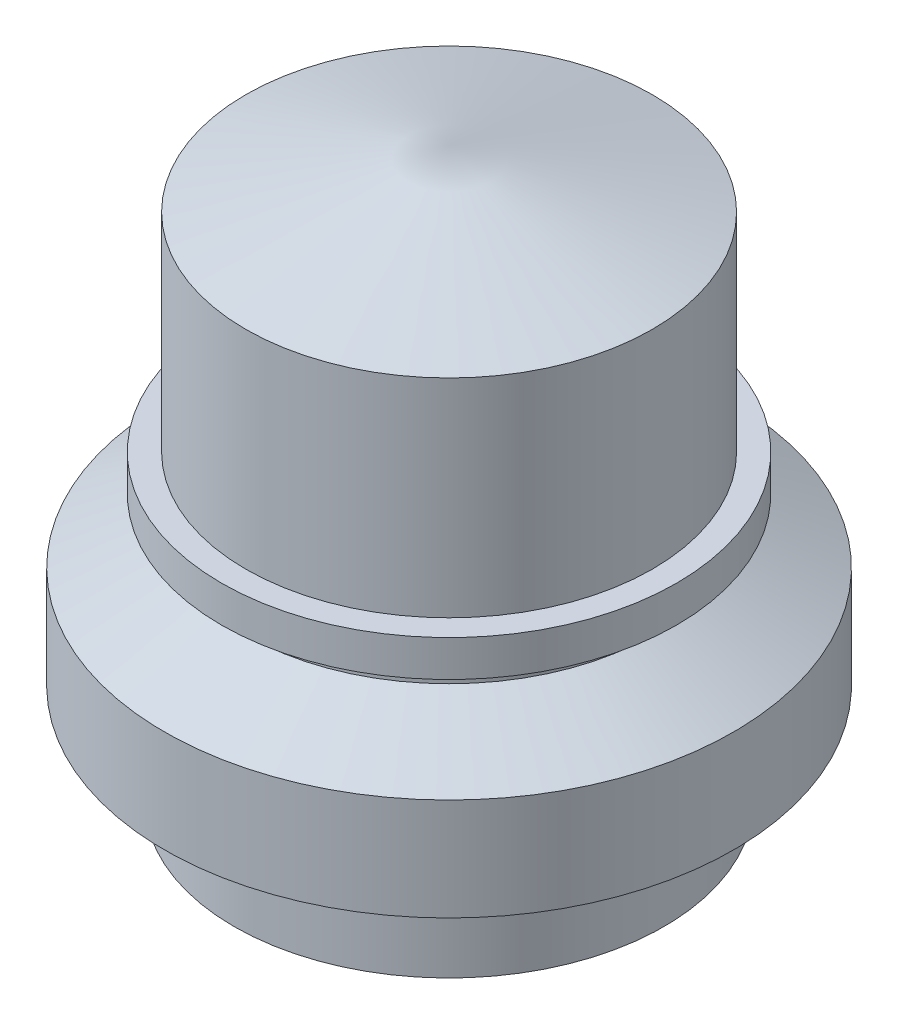
ISO-10303-21;
HEADER;
FILE_DESCRIPTION(('STEP AP214'),'2;1');
FILE_NAME('part.step','',(''),(''),'','','');
FILE_SCHEMA(('AUTOMOTIVE_DESIGN { 1 0 10303 214 1 1 1 1 }'));
ENDSEC;
DATA;
#1=APPLICATION_CONTEXT('core data for automotive mechanical design processes');
#2=APPLICATION_PROTOCOL_DEFINITION('international standard','automotive_design',2000,#1);
#3=PRODUCT_CONTEXT('',#1,'mechanical');
#4=PRODUCT('Part','Part','',(#3));
#5=PRODUCT_RELATED_PRODUCT_CATEGORY('part','',(#4));
#6=PRODUCT_DEFINITION_FORMATION('','',#4);
#7=PRODUCT_DEFINITION_CONTEXT('part definition',#1,'design');
#8=PRODUCT_DEFINITION('design','',#6,#7);
#9=PRODUCT_DEFINITION_SHAPE('','',#8);
#10=(LENGTH_UNIT() NAMED_UNIT(*) SI_UNIT(.MILLI.,.METRE.));
#11=(NAMED_UNIT(*) PLANE_ANGLE_UNIT() SI_UNIT($,.RADIAN.));
#12=(NAMED_UNIT(*) SI_UNIT($,.STERADIAN.) SOLID_ANGLE_UNIT());
#13=UNCERTAINTY_MEASURE_WITH_UNIT(LENGTH_MEASURE(1.E-05),#10,'distance_accuracy_value','');
#14=(GEOMETRIC_REPRESENTATION_CONTEXT(3) GLOBAL_UNCERTAINTY_ASSIGNED_CONTEXT((#13)) GLOBAL_UNIT_ASSIGNED_CONTEXT((#10,
#11,#12)) REPRESENTATION_CONTEXT('',''));
#15=CARTESIAN_POINT('',(0.,0.,0.));
#16=DIRECTION('',(0.,0.,1.));
#17=DIRECTION('',(1.,0.,0.));
#18=AXIS2_PLACEMENT_3D('',#15,#16,#17);
#19=CARTESIAN_POINT('',(0.,0.,0.));
#20=DIRECTION('',(0.,1.,0.));
#21=DIRECTION('',(0.,0.,1.));
#22=AXIS2_PLACEMENT_3D('',#19,#20,#21);
#23=PLANE('',#22);
#24=CARTESIAN_POINT('',(0.,0.,0.));
#25=DIRECTION('',(0.,-1.,0.));
#26=DIRECTION('',(0.,0.,-1.));
#27=AXIS2_PLACEMENT_3D('',#24,#25,#26);
#28=CIRCLE('',#27,17.);
#29=CARTESIAN_POINT('',(0.,0.,-17.));
#30=VERTEX_POINT('',#29);
#31=EDGE_CURVE('E13',#30,#30,#28,.T.);
#32=ORIENTED_EDGE('',*,*,#31,.T.);
#33=EDGE_LOOP('',(#32));
#34=FACE_BOUND('',#33,.T.);
#35=ADVANCED_FACE('F42',(#34),#23,.F.);
#36=CARTESIAN_POINT('',(0.,0.,0.));
#37=DIRECTION('',(0.,-1.,0.));
#38=DIRECTION('',(0.,0.,-1.));
#39=AXIS2_PLACEMENT_3D('',#36,#37,#38);
#40=CYLINDRICAL_SURFACE('',#39,17.);
#41=CARTESIAN_POINT('',(0.,8.00000000000001,0.));
#42=DIRECTION('',(0.,-1.,0.));
#43=DIRECTION('',(0.,0.,-1.));
#44=AXIS2_PLACEMENT_3D('',#41,#42,#43);
#45=CIRCLE('',#44,17.);
#46=CARTESIAN_POINT('',(0.,8.00000000000001,-17.));
#47=VERTEX_POINT('',#46);
#48=EDGE_CURVE('E48',#47,#47,#45,.T.);
#49=ORIENTED_EDGE('',*,*,#48,.T.);
#50=EDGE_LOOP('',(#49));
#51=FACE_BOUND('',#50,.T.);
#52=ORIENTED_EDGE('',*,*,#31,.F.);
#53=EDGE_LOOP('',(#52));
#54=FACE_BOUND('',#53,.T.);
#55=ADVANCED_FACE('F85',(#51,#54),#40,.T.);
#56=CARTESIAN_POINT('',(0.,8.00000000000001,0.));
#57=DIRECTION('',(0.,-1.,0.));
#58=DIRECTION('',(0.,0.,-1.));
#59=AXIS2_PLACEMENT_3D('',#56,#57,#58);
#60=PLANE('',#59);
#61=CARTESIAN_POINT('',(0.,8.00000000000001,0.));
#62=DIRECTION('',(0.,-1.,0.));
#63=DIRECTION('',(0.,0.,-1.));
#64=AXIS2_PLACEMENT_3D('',#61,#62,#63);
#65=CIRCLE('',#64,22.5);
#66=CARTESIAN_POINT('',(0.,8.00000000000001,-22.5));
#67=VERTEX_POINT('',#66);
#68=EDGE_CURVE('E80',#67,#67,#65,.T.);
#69=ORIENTED_EDGE('',*,*,#68,.T.);
#70=EDGE_LOOP('',(#69));
#71=FACE_BOUND('',#70,.T.);
#72=ORIENTED_EDGE('',*,*,#48,.F.);
#73=EDGE_LOOP('',(#72));
#74=FACE_BOUND('',#73,.T.);
#75=ADVANCED_FACE('F88',(#71,#74),#60,.T.);
#76=CARTESIAN_POINT('',(0.,0.,0.));
#77=DIRECTION('',(0.,-1.,0.));
#78=DIRECTION('',(0.,0.,-1.));
#79=AXIS2_PLACEMENT_3D('',#76,#77,#78);
#80=CYLINDRICAL_SURFACE('',#79,22.5);
#81=CARTESIAN_POINT('',(0.,16.0778611804609,0.));
#82=DIRECTION('',(0.,-1.,0.));
#83=DIRECTION('',(0.,0.,-1.));
#84=AXIS2_PLACEMENT_3D('',#81,#82,#83);
#85=CIRCLE('',#84,22.5);
#86=CARTESIAN_POINT('',(0.,16.0778611804609,-22.5));
#87=VERTEX_POINT('',#86);
#88=EDGE_CURVE('E77',#87,#87,#85,.T.);
#89=ORIENTED_EDGE('',*,*,#88,.T.);
#90=EDGE_LOOP('',(#89));
#91=FACE_BOUND('',#90,.T.);
#92=ORIENTED_EDGE('',*,*,#68,.F.);
#93=EDGE_LOOP('',(#92));
#94=FACE_BOUND('',#93,.T.);
#95=ADVANCED_FACE('F90',(#91,#94),#80,.T.);
#96=CARTESIAN_POINT('',(0.,16.0778611804609,0.));
#97=DIRECTION('',(0.,-1.,0.));
#98=DIRECTION('',(0.,0.,-1.));
#99=AXIS2_PLACEMENT_3D('',#96,#97,#98);
#100=CONICAL_SURFACE('',#99,22.5,1.08137451989139);
#101=CARTESIAN_POINT('',(0.,19.49933020409,0.));
#102=DIRECTION('',(0.,-1.,0.));
#103=DIRECTION('',(0.,0.,-1.));
#104=AXIS2_PLACEMENT_3D('',#101,#102,#103);
#105=CIRCLE('',#104,16.0764634518135);
#106=CARTESIAN_POINT('',(0.,19.49933020409,-16.0764634518135));
#107=VERTEX_POINT('',#106);
#108=EDGE_CURVE('E74',#107,#107,#105,.T.);
#109=ORIENTED_EDGE('',*,*,#108,.T.);
#110=EDGE_LOOP('',(#109));
#111=FACE_BOUND('',#110,.T.);
#112=ORIENTED_EDGE('',*,*,#88,.F.);
#113=EDGE_LOOP('',(#112));
#114=FACE_BOUND('',#113,.T.);
#115=ADVANCED_FACE('F97',(#111,#114),#100,.T.);
#116=CARTESIAN_POINT('',(0.,0.,0.));
#117=DIRECTION('',(0.,-1.,0.));
#118=DIRECTION('',(0.,0.,-1.));
#119=AXIS2_PLACEMENT_3D('',#116,#117,#118);
#120=CYLINDRICAL_SURFACE('',#119,16.0764634518135);
#121=CARTESIAN_POINT('',(0.,21.141635335432,0.));
#122=DIRECTION('',(0.,-1.,0.));
#123=DIRECTION('',(0.,0.,-1.));
#124=AXIS2_PLACEMENT_3D('',#121,#122,#123);
#125=CIRCLE('',#124,16.0764634518135);
#126=CARTESIAN_POINT('',(0.,21.141635335432,-16.0764634518135));
#127=VERTEX_POINT('',#126);
#128=EDGE_CURVE('E71',#127,#127,#125,.T.);
#129=ORIENTED_EDGE('',*,*,#128,.T.);
#130=EDGE_LOOP('',(#129));
#131=FACE_BOUND('',#130,.T.);
#132=ORIENTED_EDGE('',*,*,#108,.F.);
#133=EDGE_LOOP('',(#132));
#134=FACE_BOUND('',#133,.T.);
#135=ADVANCED_FACE('F122',(#131,#134),#120,.T.);
#136=CARTESIAN_POINT('',(0.,21.141635335432,0.));
#137=DIRECTION('',(0.,-1.,0.));
#138=DIRECTION('',(0.,0.,-1.));
#139=AXIS2_PLACEMENT_3D('',#136,#137,#138);
#140=PLANE('',#139);
#141=CARTESIAN_POINT('',(0.,21.141635335432,0.));
#142=DIRECTION('',(0.,-1.,0.));
#143=DIRECTION('',(0.,0.,-1.));
#144=AXIS2_PLACEMENT_3D('',#141,#142,#143);
#145=CIRCLE('',#144,17.9924861050458);
#146=CARTESIAN_POINT('',(0.,21.141635335432,-17.9924861050458));
#147=VERTEX_POINT('',#146);
#148=EDGE_CURVE('E68',#147,#147,#145,.T.);
#149=ORIENTED_EDGE('',*,*,#148,.T.);
#150=EDGE_LOOP('',(#149));
#151=FACE_BOUND('',#150,.T.);
#152=ORIENTED_EDGE('',*,*,#128,.F.);
#153=EDGE_LOOP('',(#152));
#154=FACE_BOUND('',#153,.T.);
#155=ADVANCED_FACE('F130',(#151,#154),#140,.T.);
#156=CARTESIAN_POINT('',(0.,0.,0.));
#157=DIRECTION('',(0.,-1.,0.));
#158=DIRECTION('',(0.,0.,-1.));
#159=AXIS2_PLACEMENT_3D('',#156,#157,#158);
#160=CYLINDRICAL_SURFACE('',#159,17.9924861050458);
#161=CARTESIAN_POINT('',(0.,24.0156693152804,0.));
#162=DIRECTION('',(0.,-1.,0.));
#163=DIRECTION('',(0.,0.,-1.));
#164=AXIS2_PLACEMENT_3D('',#161,#162,#163);
#165=CIRCLE('',#164,17.9924861050458);
#166=CARTESIAN_POINT('',(0.,24.0156693152804,-17.9924861050458));
#167=VERTEX_POINT('',#166);
#168=EDGE_CURVE('E63',#167,#167,#165,.T.);
#169=ORIENTED_EDGE('',*,*,#168,.T.);
#170=EDGE_LOOP('',(#169));
#171=FACE_BOUND('',#170,.T.);
#172=ORIENTED_EDGE('',*,*,#148,.F.);
#173=EDGE_LOOP('',(#172));
#174=FACE_BOUND('',#173,.T.);
#175=ADVANCED_FACE('F138',(#171,#174),#160,.T.);
#176=CARTESIAN_POINT('',(0.,24.0156693152804,0.));
#177=DIRECTION('',(0.,1.,0.));
#178=DIRECTION('',(0.,0.,1.));
#179=AXIS2_PLACEMENT_3D('',#176,#177,#178);
#180=PLANE('',#179);
#181=CARTESIAN_POINT('',(0.,24.0156693152804,0.));
#182=DIRECTION('',(0.,-1.,0.));
#183=DIRECTION('',(0.,0.,-1.));
#184=AXIS2_PLACEMENT_3D('',#181,#182,#183);
#185=CIRCLE('',#184,16.0764634518135);
#186=CARTESIAN_POINT('',(0.,24.0156693152804,-16.0764634518135));
#187=VERTEX_POINT('',#186);
#188=EDGE_CURVE('E60',#187,#187,#185,.T.);
#189=ORIENTED_EDGE('',*,*,#188,.T.);
#190=EDGE_LOOP('',(#189));
#191=FACE_BOUND('',#190,.T.);
#192=ORIENTED_EDGE('',*,*,#168,.F.);
#193=EDGE_LOOP('',(#192));
#194=FACE_BOUND('',#193,.T.);
#195=ADVANCED_FACE('F146',(#191,#194),#180,.T.);
#196=CARTESIAN_POINT('',(0.,0.,0.));
#197=DIRECTION('',(0.,-1.,0.));
#198=DIRECTION('',(0.,0.,-1.));
#199=AXIS2_PLACEMENT_3D('',#196,#197,#198);
#200=CYLINDRICAL_SURFACE('',#199,16.0764634518135);
#201=CARTESIAN_POINT('',(0.,40.4387206286999,0.));
#202=DIRECTION('',(0.,-1.,0.));
#203=DIRECTION('',(0.,0.,-1.));
#204=AXIS2_PLACEMENT_3D('',#201,#202,#203);
#205=CIRCLE('',#204,16.0764634518135);
#206=CARTESIAN_POINT('',(0.,40.4387206286999,-16.0764634518135));
#207=VERTEX_POINT('',#206);
#208=EDGE_CURVE('E58',#207,#207,#205,.T.);
#209=ORIENTED_EDGE('',*,*,#208,.T.);
#210=EDGE_LOOP('',(#209));
#211=FACE_BOUND('',#210,.T.);
#212=ORIENTED_EDGE('',*,*,#188,.F.);
#213=EDGE_LOOP('',(#212));
#214=FACE_BOUND('',#213,.T.);
#215=ADVANCED_FACE('F54',(#211,#214),#200,.T.);
#216=CARTESIAN_POINT('',(0.,40.4387206286999,0.));
#217=DIRECTION('',(0.,-1.,0.));
#218=DIRECTION('',(0.,0.,-1.));
#219=AXIS2_PLACEMENT_3D('',#216,#217,#218);
#220=CONICAL_SURFACE('',#219,16.0764634518135,1.29433765986877);
#221=CARTESIAN_POINT('',(0.,45.,0.));
#222=VERTEX_POINT('',#221);
#223=VERTEX_LOOP('',#222);
#224=FACE_BOUND('',#223,.T.);
#225=ORIENTED_EDGE('',*,*,#208,.F.);
#226=EDGE_LOOP('',(#225));
#227=FACE_BOUND('',#226,.T.);
#228=ADVANCED_FACE('F51',(#224,#227),#220,.T.);
#229=CLOSED_SHELL('',(#35,#55,#75,#95,#115,#135,#155,#175,#195,#215,#228));
#230=MANIFOLD_SOLID_BREP('B2',#229);
#231=ADVANCED_BREP_SHAPE_REPRESENTATION('',(#18,#230),#14);
#232=SHAPE_DEFINITION_REPRESENTATION(#9,#231);
ENDSEC;
END-ISO-10303-21;
